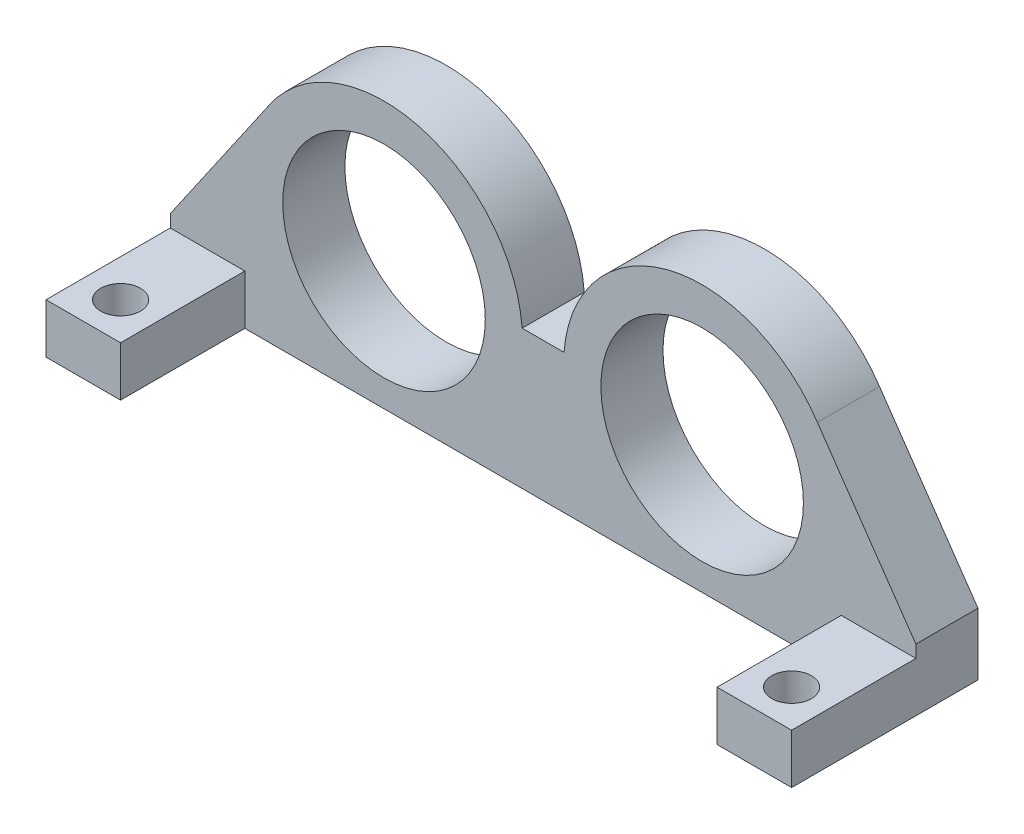
ISO-10303-21;
HEADER;
FILE_DESCRIPTION(('STEP AP214'),'2;1');
FILE_NAME('part.step','',(''),(''),'','','');
FILE_SCHEMA(('AUTOMOTIVE_DESIGN { 1 0 10303 214 1 1 1 1 }'));
ENDSEC;
DATA;
#1=APPLICATION_CONTEXT('core data for automotive mechanical design processes');
#2=APPLICATION_PROTOCOL_DEFINITION('international standard','automotive_design',2000,#1);
#3=PRODUCT_CONTEXT('',#1,'mechanical');
#4=PRODUCT('Part','Part','',(#3));
#5=PRODUCT_RELATED_PRODUCT_CATEGORY('part','',(#4));
#6=PRODUCT_DEFINITION_FORMATION('','',#4);
#7=PRODUCT_DEFINITION_CONTEXT('part definition',#1,'design');
#8=PRODUCT_DEFINITION('design','',#6,#7);
#9=PRODUCT_DEFINITION_SHAPE('','',#8);
#10=(LENGTH_UNIT() NAMED_UNIT(*) SI_UNIT(.MILLI.,.METRE.));
#11=(NAMED_UNIT(*) PLANE_ANGLE_UNIT() SI_UNIT($,.RADIAN.));
#12=(NAMED_UNIT(*) SI_UNIT($,.STERADIAN.) SOLID_ANGLE_UNIT());
#13=UNCERTAINTY_MEASURE_WITH_UNIT(LENGTH_MEASURE(1.E-05),#10,'distance_accuracy_value','');
#14=(GEOMETRIC_REPRESENTATION_CONTEXT(3) GLOBAL_UNCERTAINTY_ASSIGNED_CONTEXT((#13)) GLOBAL_UNIT_ASSIGNED_CONTEXT((#10,
#11,#12)) REPRESENTATION_CONTEXT('',''));
#15=CARTESIAN_POINT('',(0.,0.,0.));
#16=DIRECTION('',(0.,0.,1.));
#17=DIRECTION('',(1.,0.,0.));
#18=AXIS2_PLACEMENT_3D('',#15,#16,#17);
#19=CARTESIAN_POINT('',(-12.8,10.2990572190135,5.));
#20=DIRECTION('',(0.,0.,-1.));
#21=DIRECTION('',(-1.,0.,0.));
#22=AXIS2_PLACEMENT_3D('',#19,#20,#21);
#23=PLANE('',#22);
#24=CARTESIAN_POINT('',(-12.8,10.2990572190135,5.));
#25=DIRECTION('',(0.,0.,1.));
#26=DIRECTION('',(1.,0.,0.));
#27=AXIS2_PLACEMENT_3D('',#24,#25,#26);
#28=CIRCLE('',#27,8.15);
#29=CARTESIAN_POINT('',(-4.65,10.2990572190135,5.));
#30=VERTEX_POINT('',#29);
#31=EDGE_CURVE('E207',#30,#30,#28,.T.);
#32=ORIENTED_EDGE('',*,*,#31,.F.);
#33=EDGE_LOOP('',(#32));
#34=FACE_BOUND('',#33,.T.);
#35=CARTESIAN_POINT('',(12.8,10.2990572190135,5.));
#36=DIRECTION('',(0.,0.,1.));
#37=DIRECTION('',(-1.,0.,0.));
#38=AXIS2_PLACEMENT_3D('',#35,#36,#37);
#39=CIRCLE('',#38,8.15);
#40=CARTESIAN_POINT('',(4.65,10.2990572190135,5.));
#41=VERTEX_POINT('',#40);
#42=EDGE_CURVE('E201',#41,#41,#39,.T.);
#43=ORIENTED_EDGE('',*,*,#42,.F.);
#44=EDGE_LOOP('',(#43));
#45=FACE_BOUND('',#44,.T.);
#46=DIRECTION('',(-1.,0.,0.));
#47=VECTOR('',#46,1.);
#48=CARTESIAN_POINT('',(30.,4.,5.));
#49=LINE('',#48,#47);
#50=CARTESIAN_POINT('',(30.,4.,5.));
#51=VERTEX_POINT('',#50);
#52=CARTESIAN_POINT('',(24.,4.,5.));
#53=VERTEX_POINT('',#52);
#54=EDGE_CURVE('E161',#51,#53,#49,.T.);
#55=ORIENTED_EDGE('',*,*,#54,.F.);
#56=DIRECTION('',(0.,1.,0.));
#57=VECTOR('',#56,1.);
#58=CARTESIAN_POINT('',(30.,0.,5.));
#59=LINE('',#58,#57);
#60=CARTESIAN_POINT('',(30.,5.,5.));
#61=VERTEX_POINT('',#60);
#62=EDGE_CURVE('E217',#51,#61,#59,.T.);
#63=ORIENTED_EDGE('',*,*,#62,.T.);
#64=DIRECTION('',(-0.56786014343892,0.823125055804724,0.));
#65=VECTOR('',#64,1.);
#66=CARTESIAN_POINT('',(30.,5.,5.));
#67=LINE('',#66,#65);
#68=CARTESIAN_POINT('',(22.0760551043822,16.4859224753824,5.));
#69=VERTEX_POINT('',#68);
#70=EDGE_CURVE('E219',#61,#69,#67,.T.);
#71=ORIENTED_EDGE('',*,*,#70,.T.);
#72=CARTESIAN_POINT('',(12.8,10.2990572190135,5.));
#73=DIRECTION('',(0.,0.,1.));
#74=DIRECTION('',(1.,0.,0.));
#75=AXIS2_PLACEMENT_3D('',#72,#73,#74);
#76=CIRCLE('',#75,11.15);
#77=CARTESIAN_POINT('',(1.68444229891298,11.1747723518079,5.));
#78=VERTEX_POINT('',#77);
#79=EDGE_CURVE('E221',#69,#78,#76,.T.);
#80=ORIENTED_EDGE('',*,*,#79,.T.);
#81=DIRECTION('',(-1.,0.,0.));
#82=VECTOR('',#81,1.);
#83=CARTESIAN_POINT('',(-1.68444229891298,11.1747723518079,5.));
#84=LINE('',#83,#82);
#85=CARTESIAN_POINT('',(-1.68444229891298,11.1747723518079,5.));
#86=VERTEX_POINT('',#85);
#87=EDGE_CURVE('E223',#78,#86,#84,.T.);
#88=ORIENTED_EDGE('',*,*,#87,.T.);
#89=CARTESIAN_POINT('',(-12.8,10.2990572190135,5.));
#90=DIRECTION('',(0.,0.,1.));
#91=DIRECTION('',(-1.,0.,0.));
#92=AXIS2_PLACEMENT_3D('',#89,#90,#91);
#93=CIRCLE('',#92,11.15);
#94=CARTESIAN_POINT('',(-22.0760551043822,16.4859224753824,5.));
#95=VERTEX_POINT('',#94);
#96=EDGE_CURVE('E225',#86,#95,#93,.T.);
#97=ORIENTED_EDGE('',*,*,#96,.T.);
#98=DIRECTION('',(-0.56786014343892,-0.823125055804724,0.));
#99=VECTOR('',#98,1.);
#100=CARTESIAN_POINT('',(-30.,4.99999999999999,5.));
#101=LINE('',#100,#99);
#102=CARTESIAN_POINT('',(-30.,4.99999999999999,5.));
#103=VERTEX_POINT('',#102);
#104=EDGE_CURVE('E227',#95,#103,#101,.T.);
#105=ORIENTED_EDGE('',*,*,#104,.T.);
#106=DIRECTION('',(0.,-1.,0.));
#107=VECTOR('',#106,1.);
#108=CARTESIAN_POINT('',(-30.,0.,5.));
#109=LINE('',#108,#107);
#110=CARTESIAN_POINT('',(-30.,3.99999999999999,5.));
#111=VERTEX_POINT('',#110);
#112=EDGE_CURVE('E213',#103,#111,#109,.T.);
#113=ORIENTED_EDGE('',*,*,#112,.T.);
#114=DIRECTION('',(-1.,0.,0.));
#115=VECTOR('',#114,1.);
#116=CARTESIAN_POINT('',(-30.,3.99999999999999,5.));
#117=LINE('',#116,#115);
#118=CARTESIAN_POINT('',(-24.,3.99999999999999,5.));
#119=VERTEX_POINT('',#118);
#120=EDGE_CURVE('E181',#119,#111,#117,.T.);
#121=ORIENTED_EDGE('',*,*,#120,.F.);
#122=DIRECTION('',(0.,1.,0.));
#123=VECTOR('',#122,1.);
#124=CARTESIAN_POINT('',(-24.,0.,5.));
#125=LINE('',#124,#123);
#126=CARTESIAN_POINT('',(-24.,0.,5.));
#127=VERTEX_POINT('',#126);
#128=EDGE_CURVE('E176',#127,#119,#125,.T.);
#129=ORIENTED_EDGE('',*,*,#128,.F.);
#130=DIRECTION('',(1.,0.,0.));
#131=VECTOR('',#130,1.);
#132=CARTESIAN_POINT('',(30.,0.,5.));
#133=LINE('',#132,#131);
#134=CARTESIAN_POINT('',(24.,0.,5.));
#135=VERTEX_POINT('',#134);
#136=EDGE_CURVE('E58',#127,#135,#133,.T.);
#137=ORIENTED_EDGE('',*,*,#136,.T.);
#138=DIRECTION('',(0.,-1.,0.));
#139=VECTOR('',#138,1.);
#140=CARTESIAN_POINT('',(24.,0.,5.));
#141=LINE('',#140,#139);
#142=EDGE_CURVE('E53',#53,#135,#141,.T.);
#143=ORIENTED_EDGE('',*,*,#142,.F.);
#144=EDGE_LOOP('',(#55,#63,#71,#80,#88,#97,#105,#113,#121,#129,#137,#143));
#145=FACE_BOUND('',#144,.T.);
#146=ADVANCED_FACE('F38',(#34,#45,#145),#23,.F.);
#147=CARTESIAN_POINT('',(-12.8,10.2990572190135,0.));
#148=DIRECTION('',(0.,0.,-1.));
#149=DIRECTION('',(-1.,0.,0.));
#150=AXIS2_PLACEMENT_3D('',#147,#148,#149);
#151=PLANE('',#150);
#152=CARTESIAN_POINT('',(-12.8,10.2990572190135,0.));
#153=DIRECTION('',(0.,0.,1.));
#154=DIRECTION('',(1.,0.,0.));
#155=AXIS2_PLACEMENT_3D('',#152,#153,#154);
#156=CIRCLE('',#155,8.15);
#157=CARTESIAN_POINT('',(-4.65,10.2990572190135,0.));
#158=VERTEX_POINT('',#157);
#159=EDGE_CURVE('E204',#158,#158,#156,.T.);
#160=ORIENTED_EDGE('',*,*,#159,.T.);
#161=EDGE_LOOP('',(#160));
#162=FACE_BOUND('',#161,.T.);
#163=DIRECTION('',(0.,-1.,0.));
#164=VECTOR('',#163,1.);
#165=CARTESIAN_POINT('',(-30.,0.,0.));
#166=LINE('',#165,#164);
#167=CARTESIAN_POINT('',(-30.,4.99999999999999,0.));
#168=VERTEX_POINT('',#167);
#169=CARTESIAN_POINT('',(-30.,0.,0.));
#170=VERTEX_POINT('',#169);
#171=EDGE_CURVE('E210',#168,#170,#166,.T.);
#172=ORIENTED_EDGE('',*,*,#171,.F.);
#173=DIRECTION('',(-0.56786014343892,-0.823125055804724,0.));
#174=VECTOR('',#173,1.);
#175=CARTESIAN_POINT('',(-30.,4.99999999999999,0.));
#176=LINE('',#175,#174);
#177=CARTESIAN_POINT('',(-22.0760551043822,16.4859224753824,0.));
#178=VERTEX_POINT('',#177);
#179=EDGE_CURVE('E215',#178,#168,#176,.T.);
#180=ORIENTED_EDGE('',*,*,#179,.F.);
#181=CARTESIAN_POINT('',(-12.8,10.2990572190135,0.));
#182=DIRECTION('',(0.,0.,1.));
#183=DIRECTION('',(-1.,0.,0.));
#184=AXIS2_PLACEMENT_3D('',#181,#182,#183);
#185=CIRCLE('',#184,11.15);
#186=CARTESIAN_POINT('',(-1.68444229891298,11.1747723518079,0.));
#187=VERTEX_POINT('',#186);
#188=EDGE_CURVE('E241',#187,#178,#185,.T.);
#189=ORIENTED_EDGE('',*,*,#188,.F.);
#190=DIRECTION('',(-1.,0.,0.));
#191=VECTOR('',#190,1.);
#192=CARTESIAN_POINT('',(-1.68444229891298,11.1747723518079,0.));
#193=LINE('',#192,#191);
#194=CARTESIAN_POINT('',(1.68444229891298,11.1747723518079,0.));
#195=VERTEX_POINT('',#194);
#196=EDGE_CURVE('E239',#195,#187,#193,.T.);
#197=ORIENTED_EDGE('',*,*,#196,.F.);
#198=CARTESIAN_POINT('',(12.8,10.2990572190135,0.));
#199=DIRECTION('',(0.,0.,1.));
#200=DIRECTION('',(1.,0.,0.));
#201=AXIS2_PLACEMENT_3D('',#198,#199,#200);
#202=CIRCLE('',#201,11.15);
#203=CARTESIAN_POINT('',(22.0760551043822,16.4859224753824,0.));
#204=VERTEX_POINT('',#203);
#205=EDGE_CURVE('E237',#204,#195,#202,.T.);
#206=ORIENTED_EDGE('',*,*,#205,.F.);
#207=DIRECTION('',(-0.56786014343892,0.823125055804724,0.));
#208=VECTOR('',#207,1.);
#209=CARTESIAN_POINT('',(30.,5.,0.));
#210=LINE('',#209,#208);
#211=CARTESIAN_POINT('',(30.,5.,0.));
#212=VERTEX_POINT('',#211);
#213=EDGE_CURVE('E235',#212,#204,#210,.T.);
#214=ORIENTED_EDGE('',*,*,#213,.F.);
#215=DIRECTION('',(0.,1.,0.));
#216=VECTOR('',#215,1.);
#217=CARTESIAN_POINT('',(30.,0.,0.));
#218=LINE('',#217,#216);
#219=CARTESIAN_POINT('',(30.,0.,0.));
#220=VERTEX_POINT('',#219);
#221=EDGE_CURVE('E233',#220,#212,#218,.T.);
#222=ORIENTED_EDGE('',*,*,#221,.F.);
#223=DIRECTION('',(1.,0.,0.));
#224=VECTOR('',#223,1.);
#225=CARTESIAN_POINT('',(30.,0.,0.));
#226=LINE('',#225,#224);
#227=EDGE_CURVE('E143',#170,#220,#226,.T.);
#228=ORIENTED_EDGE('',*,*,#227,.F.);
#229=EDGE_LOOP('',(#172,#180,#189,#197,#206,#214,#222,#228));
#230=FACE_BOUND('',#229,.T.);
#231=CARTESIAN_POINT('',(12.8,10.2990572190135,0.));
#232=DIRECTION('',(0.,0.,1.));
#233=DIRECTION('',(-1.,0.,0.));
#234=AXIS2_PLACEMENT_3D('',#231,#232,#233);
#235=CIRCLE('',#234,8.15);
#236=CARTESIAN_POINT('',(4.65,10.2990572190135,0.));
#237=VERTEX_POINT('',#236);
#238=EDGE_CURVE('E200',#237,#237,#235,.T.);
#239=ORIENTED_EDGE('',*,*,#238,.T.);
#240=EDGE_LOOP('',(#239));
#241=FACE_BOUND('',#240,.T.);
#242=ADVANCED_FACE('F268',(#162,#230,#241),#151,.T.);
#243=CARTESIAN_POINT('',(-30.,0.,5.));
#244=DIRECTION('',(1.,0.,0.));
#245=DIRECTION('',(0.,1.,0.));
#246=AXIS2_PLACEMENT_3D('',#243,#244,#245);
#247=PLANE('',#246);
#248=ORIENTED_EDGE('',*,*,#171,.T.);
#249=DIRECTION('',(0.,0.,-1.));
#250=VECTOR('',#249,1.);
#251=CARTESIAN_POINT('',(-30.,0.,5.));
#252=LINE('',#251,#250);
#253=CARTESIAN_POINT('',(-30.,0.,15.));
#254=VERTEX_POINT('',#253);
#255=EDGE_CURVE('E11',#254,#170,#252,.T.);
#256=ORIENTED_EDGE('',*,*,#255,.F.);
#257=DIRECTION('',(0.,-1.,0.));
#258=VECTOR('',#257,1.);
#259=CARTESIAN_POINT('',(-30.,0.,15.));
#260=LINE('',#259,#258);
#261=CARTESIAN_POINT('',(-30.,3.99999999999999,15.));
#262=VERTEX_POINT('',#261);
#263=EDGE_CURVE('E177',#262,#254,#260,.T.);
#264=ORIENTED_EDGE('',*,*,#263,.F.);
#265=DIRECTION('',(0.,0.,-1.));
#266=VECTOR('',#265,1.);
#267=CARTESIAN_POINT('',(-30.,3.99999999999999,15.));
#268=LINE('',#267,#266);
#269=EDGE_CURVE('E187',#262,#111,#268,.T.);
#270=ORIENTED_EDGE('',*,*,#269,.T.);
#271=ORIENTED_EDGE('',*,*,#112,.F.);
#272=DIRECTION('',(0.,0.,-1.));
#273=VECTOR('',#272,1.);
#274=CARTESIAN_POINT('',(-30.,4.99999999999999,5.));
#275=LINE('',#274,#273);
#276=EDGE_CURVE('E229',#103,#168,#275,.T.);
#277=ORIENTED_EDGE('',*,*,#276,.T.);
#278=EDGE_LOOP('',(#248,#256,#264,#270,#271,#277));
#279=FACE_BOUND('',#278,.T.);
#280=ADVANCED_FACE('F40',(#279),#247,.F.);
#281=CARTESIAN_POINT('',(30.,0.,5.));
#282=DIRECTION('',(0.,1.,0.));
#283=DIRECTION('',(-1.,0.,0.));
#284=AXIS2_PLACEMENT_3D('',#281,#282,#283);
#285=PLANE('',#284);
#286=CARTESIAN_POINT('',(-27.,0.,12.));
#287=DIRECTION('',(0.,1.,0.));
#288=DIRECTION('',(-1.,0.,0.));
#289=AXIS2_PLACEMENT_3D('',#286,#287,#288);
#290=CIRCLE('',#289,1.6);
#291=CARTESIAN_POINT('',(-28.6,0.,12.));
#292=VERTEX_POINT('',#291);
#293=EDGE_CURVE('E164',#292,#292,#290,.T.);
#294=ORIENTED_EDGE('',*,*,#293,.T.);
#295=EDGE_LOOP('',(#294));
#296=FACE_BOUND('',#295,.T.);
#297=CARTESIAN_POINT('',(27.,0.,12.));
#298=DIRECTION('',(0.,1.,0.));
#299=DIRECTION('',(-1.,0.,0.));
#300=AXIS2_PLACEMENT_3D('',#297,#298,#299);
#301=CIRCLE('',#300,1.6);
#302=CARTESIAN_POINT('',(25.4,0.,12.));
#303=VERTEX_POINT('',#302);
#304=EDGE_CURVE('E365',#303,#303,#301,.T.);
#305=ORIENTED_EDGE('',*,*,#304,.T.);
#306=EDGE_LOOP('',(#305));
#307=FACE_BOUND('',#306,.T.);
#308=ORIENTED_EDGE('',*,*,#227,.T.);
#309=DIRECTION('',(0.,0.,-1.));
#310=VECTOR('',#309,1.);
#311=CARTESIAN_POINT('',(30.,0.,5.));
#312=LINE('',#311,#310);
#313=CARTESIAN_POINT('',(30.,0.,15.));
#314=VERTEX_POINT('',#313);
#315=EDGE_CURVE('E46',#314,#220,#312,.T.);
#316=ORIENTED_EDGE('',*,*,#315,.F.);
#317=DIRECTION('',(1.,0.,0.));
#318=VECTOR('',#317,1.);
#319=CARTESIAN_POINT('',(30.,0.,15.));
#320=LINE('',#319,#318);
#321=CARTESIAN_POINT('',(24.,0.,15.));
#322=VERTEX_POINT('',#321);
#323=EDGE_CURVE('E142',#322,#314,#320,.T.);
#324=ORIENTED_EDGE('',*,*,#323,.F.);
#325=DIRECTION('',(0.,0.,-1.));
#326=VECTOR('',#325,1.);
#327=CARTESIAN_POINT('',(24.,0.,15.));
#328=LINE('',#327,#326);
#329=EDGE_CURVE('E169',#322,#135,#328,.T.);
#330=ORIENTED_EDGE('',*,*,#329,.T.);
#331=ORIENTED_EDGE('',*,*,#136,.F.);
#332=DIRECTION('',(0.,0.,-1.));
#333=VECTOR('',#332,1.);
#334=CARTESIAN_POINT('',(-24.,0.,15.));
#335=LINE('',#334,#333);
#336=CARTESIAN_POINT('',(-24.,0.,15.));
#337=VERTEX_POINT('',#336);
#338=EDGE_CURVE('E197',#337,#127,#335,.T.);
#339=ORIENTED_EDGE('',*,*,#338,.F.);
#340=DIRECTION('',(1.,0.,0.));
#341=VECTOR('',#340,1.);
#342=CARTESIAN_POINT('',(-30.,0.,15.));
#343=LINE('',#342,#341);
#344=EDGE_CURVE('E180',#254,#337,#343,.T.);
#345=ORIENTED_EDGE('',*,*,#344,.F.);
#346=ORIENTED_EDGE('',*,*,#255,.T.);
#347=EDGE_LOOP('',(#308,#316,#324,#330,#331,#339,#345,#346));
#348=FACE_BOUND('',#347,.T.);
#349=ADVANCED_FACE('F139',(#296,#307,#348),#285,.F.);
#350=CARTESIAN_POINT('',(30.,0.,5.));
#351=DIRECTION('',(-1.,0.,0.));
#352=DIRECTION('',(0.,-1.,0.));
#353=AXIS2_PLACEMENT_3D('',#350,#351,#352);
#354=PLANE('',#353);
#355=ORIENTED_EDGE('',*,*,#221,.T.);
#356=DIRECTION('',(0.,0.,-1.));
#357=VECTOR('',#356,1.);
#358=CARTESIAN_POINT('',(30.,5.,5.));
#359=LINE('',#358,#357);
#360=EDGE_CURVE('E146',#61,#212,#359,.T.);
#361=ORIENTED_EDGE('',*,*,#360,.F.);
#362=ORIENTED_EDGE('',*,*,#62,.F.);
#363=DIRECTION('',(0.,0.,-1.));
#364=VECTOR('',#363,1.);
#365=CARTESIAN_POINT('',(30.,4.,15.));
#366=LINE('',#365,#364);
#367=CARTESIAN_POINT('',(30.,4.,15.));
#368=VERTEX_POINT('',#367);
#369=EDGE_CURVE('E151',#368,#51,#366,.T.);
#370=ORIENTED_EDGE('',*,*,#369,.F.);
#371=DIRECTION('',(0.,1.,0.));
#372=VECTOR('',#371,1.);
#373=CARTESIAN_POINT('',(30.,0.,15.));
#374=LINE('',#373,#372);
#375=EDGE_CURVE('E148',#314,#368,#374,.T.);
#376=ORIENTED_EDGE('',*,*,#375,.F.);
#377=ORIENTED_EDGE('',*,*,#315,.T.);
#378=EDGE_LOOP('',(#355,#361,#362,#370,#376,#377));
#379=FACE_BOUND('',#378,.T.);
#380=ADVANCED_FACE('F149',(#379),#354,.F.);
#381=CARTESIAN_POINT('',(30.,5.,5.));
#382=DIRECTION('',(-0.823125055804724,-0.56786014343892,0.));
#383=DIRECTION('',(0.56786014343892,-0.823125055804724,0.));
#384=AXIS2_PLACEMENT_3D('',#381,#382,#383);
#385=PLANE('',#384);
#386=ORIENTED_EDGE('',*,*,#213,.T.);
#387=DIRECTION('',(0.,0.,-1.));
#388=VECTOR('',#387,1.);
#389=CARTESIAN_POINT('',(22.0760551043822,16.4859224753824,5.));
#390=LINE('',#389,#388);
#391=EDGE_CURVE('E255',#69,#204,#390,.T.);
#392=ORIENTED_EDGE('',*,*,#391,.F.);
#393=ORIENTED_EDGE('',*,*,#70,.F.);
#394=ORIENTED_EDGE('',*,*,#360,.T.);
#395=EDGE_LOOP('',(#386,#392,#393,#394));
#396=FACE_BOUND('',#395,.T.);
#397=ADVANCED_FACE('F263',(#396),#385,.F.);
#398=CARTESIAN_POINT('',(12.8,10.2990572190135,5.));
#399=DIRECTION('',(0.,0.,-1.));
#400=DIRECTION('',(-1.,0.,0.));
#401=AXIS2_PLACEMENT_3D('',#398,#399,#400);
#402=CYLINDRICAL_SURFACE('',#401,11.15);
#403=ORIENTED_EDGE('',*,*,#205,.T.);
#404=DIRECTION('',(0.,0.,-1.));
#405=VECTOR('',#404,1.);
#406=CARTESIAN_POINT('',(1.68444229891298,11.1747723518079,5.));
#407=LINE('',#406,#405);
#408=EDGE_CURVE('E252',#78,#195,#407,.T.);
#409=ORIENTED_EDGE('',*,*,#408,.F.);
#410=ORIENTED_EDGE('',*,*,#79,.F.);
#411=ORIENTED_EDGE('',*,*,#391,.T.);
#412=EDGE_LOOP('',(#403,#409,#410,#411));
#413=FACE_BOUND('',#412,.T.);
#414=ADVANCED_FACE('F274',(#413),#402,.T.);
#415=CARTESIAN_POINT('',(-1.68444229891298,11.1747723518079,5.));
#416=DIRECTION('',(0.,-1.,0.));
#417=DIRECTION('',(0.,0.,-1.));
#418=AXIS2_PLACEMENT_3D('',#415,#416,#417);
#419=PLANE('',#418);
#420=ORIENTED_EDGE('',*,*,#196,.T.);
#421=DIRECTION('',(0.,0.,-1.));
#422=VECTOR('',#421,1.);
#423=CARTESIAN_POINT('',(-1.68444229891298,11.1747723518079,5.));
#424=LINE('',#423,#422);
#425=EDGE_CURVE('E249',#86,#187,#424,.T.);
#426=ORIENTED_EDGE('',*,*,#425,.F.);
#427=ORIENTED_EDGE('',*,*,#87,.F.);
#428=ORIENTED_EDGE('',*,*,#408,.T.);
#429=EDGE_LOOP('',(#420,#426,#427,#428));
#430=FACE_BOUND('',#429,.T.);
#431=ADVANCED_FACE('F278',(#430),#419,.F.);
#432=CARTESIAN_POINT('',(-12.8,10.2990572190135,5.));
#433=DIRECTION('',(0.,0.,-1.));
#434=DIRECTION('',(-1.,0.,0.));
#435=AXIS2_PLACEMENT_3D('',#432,#433,#434);
#436=CYLINDRICAL_SURFACE('',#435,11.15);
#437=ORIENTED_EDGE('',*,*,#188,.T.);
#438=DIRECTION('',(0.,0.,-1.));
#439=VECTOR('',#438,1.);
#440=CARTESIAN_POINT('',(-22.0760551043822,16.4859224753824,5.));
#441=LINE('',#440,#439);
#442=EDGE_CURVE('E246',#95,#178,#441,.T.);
#443=ORIENTED_EDGE('',*,*,#442,.F.);
#444=ORIENTED_EDGE('',*,*,#96,.F.);
#445=ORIENTED_EDGE('',*,*,#425,.T.);
#446=EDGE_LOOP('',(#437,#443,#444,#445));
#447=FACE_BOUND('',#446,.T.);
#448=ADVANCED_FACE('F306',(#447),#436,.T.);
#449=CARTESIAN_POINT('',(-30.,4.99999999999999,5.));
#450=DIRECTION('',(0.823125055804724,-0.56786014343892,0.));
#451=DIRECTION('',(0.56786014343892,0.823125055804724,0.));
#452=AXIS2_PLACEMENT_3D('',#449,#450,#451);
#453=PLANE('',#452);
#454=ORIENTED_EDGE('',*,*,#179,.T.);
#455=ORIENTED_EDGE('',*,*,#276,.F.);
#456=ORIENTED_EDGE('',*,*,#104,.F.);
#457=ORIENTED_EDGE('',*,*,#442,.T.);
#458=EDGE_LOOP('',(#454,#455,#456,#457));
#459=FACE_BOUND('',#458,.T.);
#460=ADVANCED_FACE('F303',(#459),#453,.F.);
#461=CARTESIAN_POINT('',(-12.8,10.2990572190135,5.));
#462=DIRECTION('',(0.,0.,-1.));
#463=DIRECTION('',(-1.,0.,0.));
#464=AXIS2_PLACEMENT_3D('',#461,#462,#463);
#465=CYLINDRICAL_SURFACE('',#464,8.15);
#466=ORIENTED_EDGE('',*,*,#31,.T.);
#467=EDGE_LOOP('',(#466));
#468=FACE_BOUND('',#467,.T.);
#469=ORIENTED_EDGE('',*,*,#159,.F.);
#470=EDGE_LOOP('',(#469));
#471=FACE_BOUND('',#470,.T.);
#472=ADVANCED_FACE('F313',(#468,#471),#465,.F.);
#473=CARTESIAN_POINT('',(12.8,10.2990572190135,5.));
#474=DIRECTION('',(0.,0.,-1.));
#475=DIRECTION('',(-1.,0.,0.));
#476=AXIS2_PLACEMENT_3D('',#473,#474,#475);
#477=CYLINDRICAL_SURFACE('',#476,8.15);
#478=ORIENTED_EDGE('',*,*,#42,.T.);
#479=EDGE_LOOP('',(#478));
#480=FACE_BOUND('',#479,.T.);
#481=ORIENTED_EDGE('',*,*,#238,.F.);
#482=EDGE_LOOP('',(#481));
#483=FACE_BOUND('',#482,.T.);
#484=ADVANCED_FACE('F329',(#480,#483),#477,.F.);
#485=CARTESIAN_POINT('',(-24.,0.,15.));
#486=DIRECTION('',(-1.,0.,0.));
#487=DIRECTION('',(0.,0.,1.));
#488=AXIS2_PLACEMENT_3D('',#485,#486,#487);
#489=PLANE('',#488);
#490=ORIENTED_EDGE('',*,*,#128,.T.);
#491=DIRECTION('',(0.,0.,-1.));
#492=VECTOR('',#491,1.);
#493=CARTESIAN_POINT('',(-24.,3.99999999999999,15.));
#494=LINE('',#493,#492);
#495=CARTESIAN_POINT('',(-24.,3.99999999999999,15.));
#496=VERTEX_POINT('',#495);
#497=EDGE_CURVE('E194',#496,#119,#494,.T.);
#498=ORIENTED_EDGE('',*,*,#497,.F.);
#499=DIRECTION('',(0.,1.,0.));
#500=VECTOR('',#499,1.);
#501=CARTESIAN_POINT('',(-24.,0.,15.));
#502=LINE('',#501,#500);
#503=EDGE_CURVE('E183',#337,#496,#502,.T.);
#504=ORIENTED_EDGE('',*,*,#503,.F.);
#505=ORIENTED_EDGE('',*,*,#338,.T.);
#506=EDGE_LOOP('',(#490,#498,#504,#505));
#507=FACE_BOUND('',#506,.T.);
#508=ADVANCED_FACE('F291',(#507),#489,.F.);
#509=CARTESIAN_POINT('',(-30.,3.99999999999999,15.));
#510=DIRECTION('',(0.,-1.,0.));
#511=DIRECTION('',(0.,0.,-1.));
#512=AXIS2_PLACEMENT_3D('',#509,#510,#511);
#513=PLANE('',#512);
#514=CARTESIAN_POINT('',(-27.,3.99999999999999,12.));
#515=DIRECTION('',(0.,1.,0.));
#516=DIRECTION('',(0.,0.,1.));
#517=AXIS2_PLACEMENT_3D('',#514,#515,#516);
#518=CIRCLE('',#517,1.6);
#519=CARTESIAN_POINT('',(-27.,3.99999999999999,13.6));
#520=VERTEX_POINT('',#519);
#521=EDGE_CURVE('E361',#520,#520,#518,.T.);
#522=ORIENTED_EDGE('',*,*,#521,.F.);
#523=EDGE_LOOP('',(#522));
#524=FACE_BOUND('',#523,.T.);
#525=ORIENTED_EDGE('',*,*,#120,.T.);
#526=ORIENTED_EDGE('',*,*,#269,.F.);
#527=DIRECTION('',(-1.,0.,0.));
#528=VECTOR('',#527,1.);
#529=CARTESIAN_POINT('',(-30.,3.99999999999999,15.));
#530=LINE('',#529,#528);
#531=EDGE_CURVE('E185',#496,#262,#530,.T.);
#532=ORIENTED_EDGE('',*,*,#531,.F.);
#533=ORIENTED_EDGE('',*,*,#497,.T.);
#534=EDGE_LOOP('',(#525,#526,#532,#533));
#535=FACE_BOUND('',#534,.T.);
#536=ADVANCED_FACE('F336',(#524,#535),#513,.F.);
#537=CARTESIAN_POINT('',(0.,0.,15.));
#538=DIRECTION('',(0.,0.,-1.));
#539=DIRECTION('',(-1.,0.,0.));
#540=AXIS2_PLACEMENT_3D('',#537,#538,#539);
#541=PLANE('',#540);
#542=ORIENTED_EDGE('',*,*,#263,.T.);
#543=ORIENTED_EDGE('',*,*,#344,.T.);
#544=ORIENTED_EDGE('',*,*,#503,.T.);
#545=ORIENTED_EDGE('',*,*,#531,.T.);
#546=EDGE_LOOP('',(#542,#543,#544,#545));
#547=FACE_BOUND('',#546,.T.);
#548=ADVANCED_FACE('F295',(#547),#541,.F.);
#549=CARTESIAN_POINT('',(30.,4.,15.));
#550=DIRECTION('',(0.,-1.,0.));
#551=DIRECTION('',(1.,0.,0.));
#552=AXIS2_PLACEMENT_3D('',#549,#550,#551);
#553=PLANE('',#552);
#554=CARTESIAN_POINT('',(27.,3.99999999999999,12.));
#555=DIRECTION('',(0.,1.,0.));
#556=DIRECTION('',(0.,0.,1.));
#557=AXIS2_PLACEMENT_3D('',#554,#555,#556);
#558=CIRCLE('',#557,1.6);
#559=CARTESIAN_POINT('',(27.,3.99999999999999,13.6));
#560=VERTEX_POINT('',#559);
#561=EDGE_CURVE('E369',#560,#560,#558,.T.);
#562=ORIENTED_EDGE('',*,*,#561,.F.);
#563=EDGE_LOOP('',(#562));
#564=FACE_BOUND('',#563,.T.);
#565=ORIENTED_EDGE('',*,*,#54,.T.);
#566=DIRECTION('',(0.,0.,-1.));
#567=VECTOR('',#566,1.);
#568=CARTESIAN_POINT('',(24.,4.,15.));
#569=LINE('',#568,#567);
#570=CARTESIAN_POINT('',(24.,4.,15.));
#571=VERTEX_POINT('',#570);
#572=EDGE_CURVE('E172',#571,#53,#569,.T.);
#573=ORIENTED_EDGE('',*,*,#572,.F.);
#574=DIRECTION('',(-1.,0.,0.));
#575=VECTOR('',#574,1.);
#576=CARTESIAN_POINT('',(30.,4.,15.));
#577=LINE('',#576,#575);
#578=EDGE_CURVE('E154',#368,#571,#577,.T.);
#579=ORIENTED_EDGE('',*,*,#578,.F.);
#580=ORIENTED_EDGE('',*,*,#369,.T.);
#581=EDGE_LOOP('',(#565,#573,#579,#580));
#582=FACE_BOUND('',#581,.T.);
#583=ADVANCED_FACE('F284',(#564,#582),#553,.F.);
#584=CARTESIAN_POINT('',(24.,0.,15.));
#585=DIRECTION('',(1.,0.,0.));
#586=DIRECTION('',(0.,0.,-1.));
#587=AXIS2_PLACEMENT_3D('',#584,#585,#586);
#588=PLANE('',#587);
#589=ORIENTED_EDGE('',*,*,#142,.T.);
#590=ORIENTED_EDGE('',*,*,#329,.F.);
#591=DIRECTION('',(0.,-1.,0.));
#592=VECTOR('',#591,1.);
#593=CARTESIAN_POINT('',(24.,0.,15.));
#594=LINE('',#593,#592);
#595=EDGE_CURVE('E158',#571,#322,#594,.T.);
#596=ORIENTED_EDGE('',*,*,#595,.F.);
#597=ORIENTED_EDGE('',*,*,#572,.T.);
#598=EDGE_LOOP('',(#589,#590,#596,#597));
#599=FACE_BOUND('',#598,.T.);
#600=ADVANCED_FACE('F286',(#599),#588,.F.);
#601=CARTESIAN_POINT('',(0.,0.,15.));
#602=DIRECTION('',(0.,0.,-1.));
#603=DIRECTION('',(-1.,0.,0.));
#604=AXIS2_PLACEMENT_3D('',#601,#602,#603);
#605=PLANE('',#604);
#606=ORIENTED_EDGE('',*,*,#323,.T.);
#607=ORIENTED_EDGE('',*,*,#375,.T.);
#608=ORIENTED_EDGE('',*,*,#578,.T.);
#609=ORIENTED_EDGE('',*,*,#595,.T.);
#610=EDGE_LOOP('',(#606,#607,#608,#609));
#611=FACE_BOUND('',#610,.T.);
#612=ADVANCED_FACE('F156',(#611),#605,.F.);
#613=CARTESIAN_POINT('',(27.,-6.00000000000001,12.));
#614=DIRECTION('',(0.,1.,0.));
#615=DIRECTION('',(0.,0.,1.));
#616=AXIS2_PLACEMENT_3D('',#613,#614,#615);
#617=CYLINDRICAL_SURFACE('',#616,1.6);
#618=ORIENTED_EDGE('',*,*,#561,.T.);
#619=EDGE_LOOP('',(#618));
#620=FACE_BOUND('',#619,.T.);
#621=ORIENTED_EDGE('',*,*,#304,.F.);
#622=EDGE_LOOP('',(#621));
#623=FACE_BOUND('',#622,.T.);
#624=ADVANCED_FACE('F349',(#620,#623),#617,.F.);
#625=CARTESIAN_POINT('',(-27.,-6.00000000000001,12.));
#626=DIRECTION('',(0.,1.,0.));
#627=DIRECTION('',(0.,0.,1.));
#628=AXIS2_PLACEMENT_3D('',#625,#626,#627);
#629=CYLINDRICAL_SURFACE('',#628,1.6);
#630=ORIENTED_EDGE('',*,*,#521,.T.);
#631=EDGE_LOOP('',(#630));
#632=FACE_BOUND('',#631,.T.);
#633=ORIENTED_EDGE('',*,*,#293,.F.);
#634=EDGE_LOOP('',(#633));
#635=FACE_BOUND('',#634,.T.);
#636=ADVANCED_FACE('F352',(#632,#635),#629,.F.);
#637=CLOSED_SHELL('',(#146,#242,#280,#349,#380,#397,#414,#431,#448,#460,#472,#484,#508,#536,
#548,#583,#600,#612,#624,#636));
#638=MANIFOLD_SOLID_BREP('B2',#637);
#639=ADVANCED_BREP_SHAPE_REPRESENTATION('',(#18,#638),#14);
#640=SHAPE_DEFINITION_REPRESENTATION(#9,#639);
ENDSEC;
END-ISO-10303-21;
